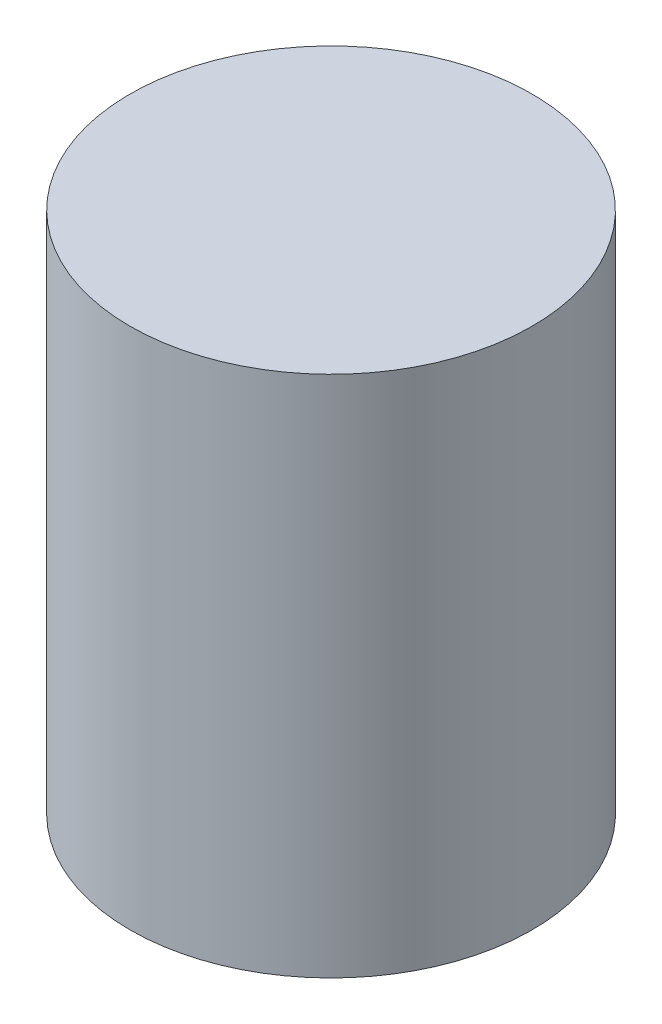
ISO-10303-21;
HEADER;
FILE_DESCRIPTION(('STEP AP214'),'2;1');
FILE_NAME('part.step','',(''),(''),'','','');
FILE_SCHEMA(('AUTOMOTIVE_DESIGN { 1 0 10303 214 1 1 1 1 }'));
ENDSEC;
DATA;
#1=APPLICATION_CONTEXT('core data for automotive mechanical design processes');
#2=APPLICATION_PROTOCOL_DEFINITION('international standard','automotive_design',2000,#1);
#3=PRODUCT_CONTEXT('',#1,'mechanical');
#4=PRODUCT('Part','Part','',(#3));
#5=PRODUCT_RELATED_PRODUCT_CATEGORY('part','',(#4));
#6=PRODUCT_DEFINITION_FORMATION('','',#4);
#7=PRODUCT_DEFINITION_CONTEXT('part definition',#1,'design');
#8=PRODUCT_DEFINITION('design','',#6,#7);
#9=PRODUCT_DEFINITION_SHAPE('','',#8);
#10=(LENGTH_UNIT() NAMED_UNIT(*) SI_UNIT(.MILLI.,.METRE.));
#11=(NAMED_UNIT(*) PLANE_ANGLE_UNIT() SI_UNIT($,.RADIAN.));
#12=(NAMED_UNIT(*) SI_UNIT($,.STERADIAN.) SOLID_ANGLE_UNIT());
#13=UNCERTAINTY_MEASURE_WITH_UNIT(LENGTH_MEASURE(1.E-05),#10,'distance_accuracy_value','');
#14=(GEOMETRIC_REPRESENTATION_CONTEXT(3) GLOBAL_UNCERTAINTY_ASSIGNED_CONTEXT((#13)) GLOBAL_UNIT_ASSIGNED_CONTEXT((#10,
#11,#12)) REPRESENTATION_CONTEXT('',''));
#15=CARTESIAN_POINT('',(0.,0.,0.));
#16=DIRECTION('',(0.,0.,1.));
#17=DIRECTION('',(1.,0.,0.));
#18=AXIS2_PLACEMENT_3D('',#15,#16,#17);
#19=CARTESIAN_POINT('',(-38.6220215439656,11.7,-12.531613373308));
#20=DIRECTION('',(0.,-1.,0.));
#21=DIRECTION('',(0.,0.,-1.));
#22=AXIS2_PLACEMENT_3D('',#19,#20,#21);
#23=CYLINDRICAL_SURFACE('',#22,4.5);
#24=CARTESIAN_POINT('',(-38.6220215439656,11.7,-12.531613373308));
#25=DIRECTION('',(0.,1.,0.));
#26=DIRECTION('',(0.,0.,1.));
#27=AXIS2_PLACEMENT_3D('',#24,#25,#26);
#28=CIRCLE('',#27,4.5);
#29=CARTESIAN_POINT('',(-38.6220215439656,11.7,-8.031613373308));
#30=VERTEX_POINT('',#29);
#31=EDGE_CURVE('E10',#30,#30,#28,.T.);
#32=ORIENTED_EDGE('',*,*,#31,.F.);
#33=EDGE_LOOP('',(#32));
#34=FACE_BOUND('',#33,.T.);
#35=CARTESIAN_POINT('',(-38.6220215439656,0.,-12.531613373308));
#36=DIRECTION('',(0.,1.,0.));
#37=DIRECTION('',(0.,0.,1.));
#38=AXIS2_PLACEMENT_3D('',#35,#36,#37);
#39=CIRCLE('',#38,4.5);
#40=CARTESIAN_POINT('',(-38.6220215439656,0.,-8.031613373308));
#41=VERTEX_POINT('',#40);
#42=EDGE_CURVE('E40',#41,#41,#39,.T.);
#43=ORIENTED_EDGE('',*,*,#42,.T.);
#44=EDGE_LOOP('',(#43));
#45=FACE_BOUND('',#44,.T.);
#46=ADVANCED_FACE('F37',(#34,#45),#23,.T.);
#47=CARTESIAN_POINT('',(-38.6220215439656,11.7,-12.531613373308));
#48=DIRECTION('',(0.,1.,0.));
#49=DIRECTION('',(0.,0.,1.));
#50=AXIS2_PLACEMENT_3D('',#47,#48,#49);
#51=PLANE('',#50);
#52=ORIENTED_EDGE('',*,*,#31,.T.);
#53=EDGE_LOOP('',(#52));
#54=FACE_BOUND('',#53,.T.);
#55=ADVANCED_FACE('F54',(#54),#51,.T.);
#56=CARTESIAN_POINT('',(-38.6220215439656,0.,-12.531613373308));
#57=DIRECTION('',(0.,1.,0.));
#58=DIRECTION('',(0.,0.,1.));
#59=AXIS2_PLACEMENT_3D('',#56,#57,#58);
#60=PLANE('',#59);
#61=ORIENTED_EDGE('',*,*,#42,.F.);
#62=EDGE_LOOP('',(#61));
#63=FACE_BOUND('',#62,.T.);
#64=ADVANCED_FACE('F52',(#63),#60,.F.);
#65=CLOSED_SHELL('',(#46,#55,#64));
#66=MANIFOLD_SOLID_BREP('B2',#65);
#67=ADVANCED_BREP_SHAPE_REPRESENTATION('',(#18,#66),#14);
#68=SHAPE_DEFINITION_REPRESENTATION(#9,#67);
ENDSEC;
END-ISO-10303-21;
